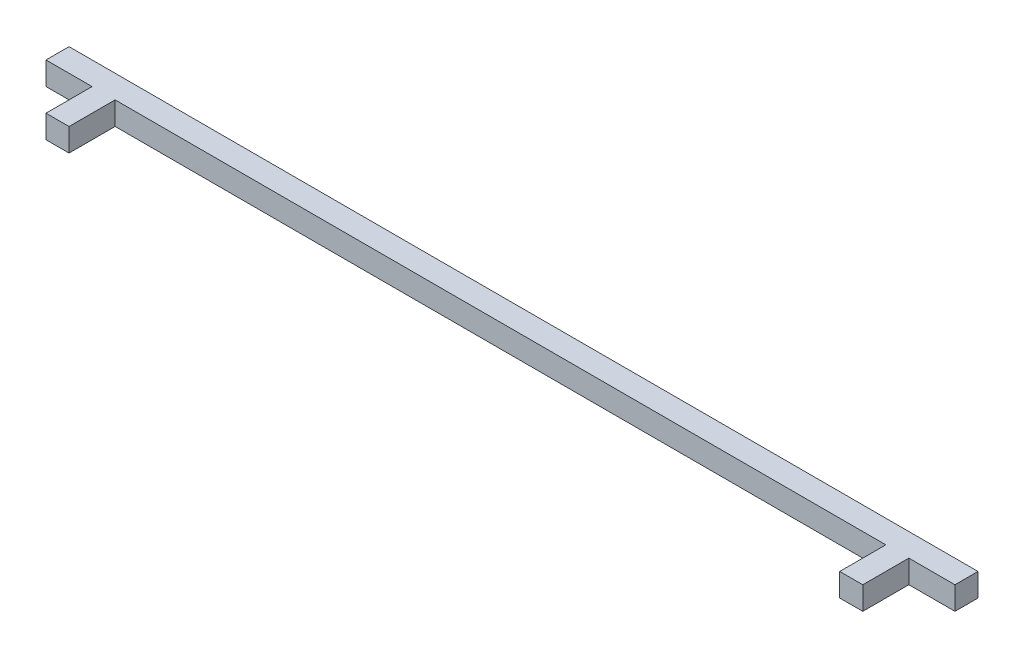
ISO-10303-21;
HEADER;
FILE_DESCRIPTION(('STEP AP214'),'2;1');
FILE_NAME('part.step','',(''),(''),'','','');
FILE_SCHEMA(('AUTOMOTIVE_DESIGN { 1 0 10303 214 1 1 1 1 }'));
ENDSEC;
DATA;
#1=APPLICATION_CONTEXT('core data for automotive mechanical design processes');
#2=APPLICATION_PROTOCOL_DEFINITION('international standard','automotive_design',2000,#1);
#3=PRODUCT_CONTEXT('',#1,'mechanical');
#4=PRODUCT('Part','Part','',(#3));
#5=PRODUCT_RELATED_PRODUCT_CATEGORY('part','',(#4));
#6=PRODUCT_DEFINITION_FORMATION('','',#4);
#7=PRODUCT_DEFINITION_CONTEXT('part definition',#1,'design');
#8=PRODUCT_DEFINITION('design','',#6,#7);
#9=PRODUCT_DEFINITION_SHAPE('','',#8);
#10=(LENGTH_UNIT() NAMED_UNIT(*) SI_UNIT(.MILLI.,.METRE.));
#11=(NAMED_UNIT(*) PLANE_ANGLE_UNIT() SI_UNIT($,.RADIAN.));
#12=(NAMED_UNIT(*) SI_UNIT($,.STERADIAN.) SOLID_ANGLE_UNIT());
#13=UNCERTAINTY_MEASURE_WITH_UNIT(LENGTH_MEASURE(1.E-05),#10,'distance_accuracy_value','');
#14=(GEOMETRIC_REPRESENTATION_CONTEXT(3) GLOBAL_UNCERTAINTY_ASSIGNED_CONTEXT((#13)) GLOBAL_UNIT_ASSIGNED_CONTEXT((#10,
#11,#12)) REPRESENTATION_CONTEXT('',''));
#15=CARTESIAN_POINT('',(0.,0.,0.));
#16=DIRECTION('',(0.,0.,1.));
#17=DIRECTION('',(1.,0.,0.));
#18=AXIS2_PLACEMENT_3D('',#15,#16,#17);
#19=CARTESIAN_POINT('',(6.,3.,0.));
#20=DIRECTION('',(0.,0.,-1.));
#21=DIRECTION('',(-1.,0.,0.));
#22=AXIS2_PLACEMENT_3D('',#19,#20,#21);
#23=PLANE('',#22);
#24=DIRECTION('',(1.,0.,0.));
#25=VECTOR('',#24,1.);
#26=CARTESIAN_POINT('',(6.,0.,0.));
#27=LINE('',#26,#25);
#28=CARTESIAN_POINT('',(0.,0.,0.));
#29=VERTEX_POINT('',#28);
#30=CARTESIAN_POINT('',(6.,0.,0.));
#31=VERTEX_POINT('',#30);
#32=EDGE_CURVE('E153',#29,#31,#27,.T.);
#33=ORIENTED_EDGE('',*,*,#32,.T.);
#34=DIRECTION('',(0.,-1.,0.));
#35=VECTOR('',#34,1.);
#36=CARTESIAN_POINT('',(6.,3.,0.));
#37=LINE('',#36,#35);
#38=CARTESIAN_POINT('',(6.,3.,0.));
#39=VERTEX_POINT('',#38);
#40=EDGE_CURVE('E11',#39,#31,#37,.T.);
#41=ORIENTED_EDGE('',*,*,#40,.F.);
#42=DIRECTION('',(1.,0.,0.));
#43=VECTOR('',#42,1.);
#44=CARTESIAN_POINT('',(6.,3.,0.));
#45=LINE('',#44,#43);
#46=CARTESIAN_POINT('',(0.,3.,0.));
#47=VERTEX_POINT('',#46);
#48=EDGE_CURVE('E175',#47,#39,#45,.T.);
#49=ORIENTED_EDGE('',*,*,#48,.F.);
#50=DIRECTION('',(0.,-1.,0.));
#51=VECTOR('',#50,1.);
#52=CARTESIAN_POINT('',(0.,3.,0.));
#53=LINE('',#52,#51);
#54=EDGE_CURVE('E149',#47,#29,#53,.T.);
#55=ORIENTED_EDGE('',*,*,#54,.T.);
#56=EDGE_LOOP('',(#33,#41,#49,#55));
#57=FACE_BOUND('',#56,.T.);
#58=ADVANCED_FACE('F33',(#57),#23,.F.);
#59=CARTESIAN_POINT('',(6.,3.,6.00000000000003));
#60=DIRECTION('',(1.,0.,0.));
#61=DIRECTION('',(0.,0.,-1.));
#62=AXIS2_PLACEMENT_3D('',#59,#60,#61);
#63=PLANE('',#62);
#64=DIRECTION('',(0.,0.,1.));
#65=VECTOR('',#64,1.);
#66=CARTESIAN_POINT('',(6.,0.,6.00000000000003));
#67=LINE('',#66,#65);
#68=CARTESIAN_POINT('',(6.,0.,6.00000000000003));
#69=VERTEX_POINT('',#68);
#70=EDGE_CURVE('E156',#31,#69,#67,.T.);
#71=ORIENTED_EDGE('',*,*,#70,.T.);
#72=DIRECTION('',(0.,-1.,0.));
#73=VECTOR('',#72,1.);
#74=CARTESIAN_POINT('',(6.,3.,6.00000000000003));
#75=LINE('',#74,#73);
#76=CARTESIAN_POINT('',(6.,3.,6.00000000000003));
#77=VERTEX_POINT('',#76);
#78=EDGE_CURVE('E41',#77,#69,#75,.T.);
#79=ORIENTED_EDGE('',*,*,#78,.F.);
#80=DIRECTION('',(0.,0.,1.));
#81=VECTOR('',#80,1.);
#82=CARTESIAN_POINT('',(6.,3.,6.00000000000003));
#83=LINE('',#82,#81);
#84=EDGE_CURVE('E104',#39,#77,#83,.T.);
#85=ORIENTED_EDGE('',*,*,#84,.F.);
#86=ORIENTED_EDGE('',*,*,#40,.T.);
#87=EDGE_LOOP('',(#71,#79,#85,#86));
#88=FACE_BOUND('',#87,.T.);
#89=ADVANCED_FACE('F253',(#88),#63,.F.);
#90=CARTESIAN_POINT('',(9.,3.,6.00000000000003));
#91=DIRECTION('',(0.,0.,-1.));
#92=DIRECTION('',(-1.,0.,0.));
#93=AXIS2_PLACEMENT_3D('',#90,#91,#92);
#94=PLANE('',#93);
#95=DIRECTION('',(1.,0.,0.));
#96=VECTOR('',#95,1.);
#97=CARTESIAN_POINT('',(9.,0.,6.00000000000003));
#98=LINE('',#97,#96);
#99=CARTESIAN_POINT('',(9.,0.,6.00000000000003));
#100=VERTEX_POINT('',#99);
#101=EDGE_CURVE('E158',#69,#100,#98,.T.);
#102=ORIENTED_EDGE('',*,*,#101,.T.);
#103=DIRECTION('',(0.,-1.,0.));
#104=VECTOR('',#103,1.);
#105=CARTESIAN_POINT('',(9.,3.,6.00000000000003));
#106=LINE('',#105,#104);
#107=CARTESIAN_POINT('',(9.,3.,6.00000000000003));
#108=VERTEX_POINT('',#107);
#109=EDGE_CURVE('E194',#108,#100,#106,.T.);
#110=ORIENTED_EDGE('',*,*,#109,.F.);
#111=DIRECTION('',(1.,0.,0.));
#112=VECTOR('',#111,1.);
#113=CARTESIAN_POINT('',(9.,3.,6.00000000000003));
#114=LINE('',#113,#112);
#115=EDGE_CURVE('E202',#77,#108,#114,.T.);
#116=ORIENTED_EDGE('',*,*,#115,.F.);
#117=ORIENTED_EDGE('',*,*,#78,.T.);
#118=EDGE_LOOP('',(#102,#110,#116,#117));
#119=FACE_BOUND('',#118,.T.);
#120=ADVANCED_FACE('F200',(#119),#94,.F.);
#121=CARTESIAN_POINT('',(9.,3.,0.));
#122=DIRECTION('',(-1.,0.,0.));
#123=DIRECTION('',(0.,0.,1.));
#124=AXIS2_PLACEMENT_3D('',#121,#122,#123);
#125=PLANE('',#124);
#126=DIRECTION('',(0.,0.,-1.));
#127=VECTOR('',#126,1.);
#128=CARTESIAN_POINT('',(9.,0.,0.));
#129=LINE('',#128,#127);
#130=CARTESIAN_POINT('',(9.,0.,0.));
#131=VERTEX_POINT('',#130);
#132=EDGE_CURVE('E160',#100,#131,#129,.T.);
#133=ORIENTED_EDGE('',*,*,#132,.T.);
#134=DIRECTION('',(0.,-1.,0.));
#135=VECTOR('',#134,1.);
#136=CARTESIAN_POINT('',(9.,3.,0.));
#137=LINE('',#136,#135);
#138=CARTESIAN_POINT('',(9.,3.,0.));
#139=VERTEX_POINT('',#138);
#140=EDGE_CURVE('E191',#139,#131,#137,.T.);
#141=ORIENTED_EDGE('',*,*,#140,.F.);
#142=DIRECTION('',(0.,0.,-1.));
#143=VECTOR('',#142,1.);
#144=CARTESIAN_POINT('',(9.,3.,0.));
#145=LINE('',#144,#143);
#146=EDGE_CURVE('E220',#108,#139,#145,.T.);
#147=ORIENTED_EDGE('',*,*,#146,.F.);
#148=ORIENTED_EDGE('',*,*,#109,.T.);
#149=EDGE_LOOP('',(#133,#141,#147,#148));
#150=FACE_BOUND('',#149,.T.);
#151=ADVANCED_FACE('F211',(#150),#125,.F.);
#152=CARTESIAN_POINT('',(109.32,3.,0.));
#153=DIRECTION('',(0.,0.,-1.));
#154=DIRECTION('',(-1.,0.,0.));
#155=AXIS2_PLACEMENT_3D('',#152,#153,#154);
#156=PLANE('',#155);
#157=DIRECTION('',(1.,0.,0.));
#158=VECTOR('',#157,1.);
#159=CARTESIAN_POINT('',(109.32,0.,0.));
#160=LINE('',#159,#158);
#161=CARTESIAN_POINT('',(109.32,0.,0.));
#162=VERTEX_POINT('',#161);
#163=EDGE_CURVE('E162',#131,#162,#160,.T.);
#164=ORIENTED_EDGE('',*,*,#163,.T.);
#165=DIRECTION('',(0.,-1.,0.));
#166=VECTOR('',#165,1.);
#167=CARTESIAN_POINT('',(109.32,3.,0.));
#168=LINE('',#167,#166);
#169=CARTESIAN_POINT('',(109.32,3.,0.));
#170=VERTEX_POINT('',#169);
#171=EDGE_CURVE('E188',#170,#162,#168,.T.);
#172=ORIENTED_EDGE('',*,*,#171,.F.);
#173=DIRECTION('',(1.,0.,0.));
#174=VECTOR('',#173,1.);
#175=CARTESIAN_POINT('',(109.32,3.,0.));
#176=LINE('',#175,#174);
#177=EDGE_CURVE('E217',#139,#170,#176,.T.);
#178=ORIENTED_EDGE('',*,*,#177,.F.);
#179=ORIENTED_EDGE('',*,*,#140,.T.);
#180=EDGE_LOOP('',(#164,#172,#178,#179));
#181=FACE_BOUND('',#180,.T.);
#182=ADVANCED_FACE('F215',(#181),#156,.F.);
#183=CARTESIAN_POINT('',(109.32,3.,6.));
#184=DIRECTION('',(1.,0.,0.));
#185=DIRECTION('',(0.,0.,-1.));
#186=AXIS2_PLACEMENT_3D('',#183,#184,#185);
#187=PLANE('',#186);
#188=DIRECTION('',(0.,0.,1.));
#189=VECTOR('',#188,1.);
#190=CARTESIAN_POINT('',(109.32,0.,6.));
#191=LINE('',#190,#189);
#192=CARTESIAN_POINT('',(109.32,0.,6.));
#193=VERTEX_POINT('',#192);
#194=EDGE_CURVE('E164',#162,#193,#191,.T.);
#195=ORIENTED_EDGE('',*,*,#194,.T.);
#196=DIRECTION('',(0.,-1.,0.));
#197=VECTOR('',#196,1.);
#198=CARTESIAN_POINT('',(109.32,3.,6.));
#199=LINE('',#198,#197);
#200=CARTESIAN_POINT('',(109.32,3.,6.));
#201=VERTEX_POINT('',#200);
#202=EDGE_CURVE('E185',#201,#193,#199,.T.);
#203=ORIENTED_EDGE('',*,*,#202,.F.);
#204=DIRECTION('',(0.,0.,1.));
#205=VECTOR('',#204,1.);
#206=CARTESIAN_POINT('',(109.32,3.,6.));
#207=LINE('',#206,#205);
#208=EDGE_CURVE('E219',#170,#201,#207,.T.);
#209=ORIENTED_EDGE('',*,*,#208,.F.);
#210=ORIENTED_EDGE('',*,*,#171,.T.);
#211=EDGE_LOOP('',(#195,#203,#209,#210));
#212=FACE_BOUND('',#211,.T.);
#213=ADVANCED_FACE('F266',(#212),#187,.F.);
#214=CARTESIAN_POINT('',(112.32,3.,6.));
#215=DIRECTION('',(0.,0.,-1.));
#216=DIRECTION('',(-1.,0.,0.));
#217=AXIS2_PLACEMENT_3D('',#214,#215,#216);
#218=PLANE('',#217);
#219=DIRECTION('',(1.,0.,0.));
#220=VECTOR('',#219,1.);
#221=CARTESIAN_POINT('',(112.32,0.,6.));
#222=LINE('',#221,#220);
#223=CARTESIAN_POINT('',(112.32,0.,6.));
#224=VERTEX_POINT('',#223);
#225=EDGE_CURVE('E166',#193,#224,#222,.T.);
#226=ORIENTED_EDGE('',*,*,#225,.T.);
#227=DIRECTION('',(0.,-1.,0.));
#228=VECTOR('',#227,1.);
#229=CARTESIAN_POINT('',(112.32,3.,6.));
#230=LINE('',#229,#228);
#231=CARTESIAN_POINT('',(112.32,3.,6.));
#232=VERTEX_POINT('',#231);
#233=EDGE_CURVE('E182',#232,#224,#230,.T.);
#234=ORIENTED_EDGE('',*,*,#233,.F.);
#235=DIRECTION('',(1.,0.,0.));
#236=VECTOR('',#235,1.);
#237=CARTESIAN_POINT('',(112.32,3.,6.));
#238=LINE('',#237,#236);
#239=EDGE_CURVE('E222',#201,#232,#238,.T.);
#240=ORIENTED_EDGE('',*,*,#239,.F.);
#241=ORIENTED_EDGE('',*,*,#202,.T.);
#242=EDGE_LOOP('',(#226,#234,#240,#241));
#243=FACE_BOUND('',#242,.T.);
#244=ADVANCED_FACE('F269',(#243),#218,.F.);
#245=CARTESIAN_POINT('',(112.32,3.,0.));
#246=DIRECTION('',(-1.,0.,0.));
#247=DIRECTION('',(0.,0.,1.));
#248=AXIS2_PLACEMENT_3D('',#245,#246,#247);
#249=PLANE('',#248);
#250=DIRECTION('',(0.,0.,-1.));
#251=VECTOR('',#250,1.);
#252=CARTESIAN_POINT('',(112.32,0.,0.));
#253=LINE('',#252,#251);
#254=CARTESIAN_POINT('',(112.32,0.,0.));
#255=VERTEX_POINT('',#254);
#256=EDGE_CURVE('E168',#224,#255,#253,.T.);
#257=ORIENTED_EDGE('',*,*,#256,.T.);
#258=DIRECTION('',(0.,-1.,0.));
#259=VECTOR('',#258,1.);
#260=CARTESIAN_POINT('',(112.32,3.,0.));
#261=LINE('',#260,#259);
#262=CARTESIAN_POINT('',(112.32,3.,0.));
#263=VERTEX_POINT('',#262);
#264=EDGE_CURVE('E179',#263,#255,#261,.T.);
#265=ORIENTED_EDGE('',*,*,#264,.F.);
#266=DIRECTION('',(0.,0.,-1.));
#267=VECTOR('',#266,1.);
#268=CARTESIAN_POINT('',(112.32,3.,0.));
#269=LINE('',#268,#267);
#270=EDGE_CURVE('E228',#232,#263,#269,.T.);
#271=ORIENTED_EDGE('',*,*,#270,.F.);
#272=ORIENTED_EDGE('',*,*,#233,.T.);
#273=EDGE_LOOP('',(#257,#265,#271,#272));
#274=FACE_BOUND('',#273,.T.);
#275=ADVANCED_FACE('F234',(#274),#249,.F.);
#276=CARTESIAN_POINT('',(118.32,3.,0.));
#277=DIRECTION('',(0.,0.,-1.));
#278=DIRECTION('',(-1.,0.,0.));
#279=AXIS2_PLACEMENT_3D('',#276,#277,#278);
#280=PLANE('',#279);
#281=DIRECTION('',(1.,0.,0.));
#282=VECTOR('',#281,1.);
#283=CARTESIAN_POINT('',(118.32,0.,0.));
#284=LINE('',#283,#282);
#285=CARTESIAN_POINT('',(118.32,0.,0.));
#286=VERTEX_POINT('',#285);
#287=EDGE_CURVE('E170',#255,#286,#284,.T.);
#288=ORIENTED_EDGE('',*,*,#287,.T.);
#289=DIRECTION('',(0.,-1.,0.));
#290=VECTOR('',#289,1.);
#291=CARTESIAN_POINT('',(118.32,3.,0.));
#292=LINE('',#291,#290);
#293=CARTESIAN_POINT('',(118.32,3.,0.));
#294=VERTEX_POINT('',#293);
#295=EDGE_CURVE('E144',#294,#286,#292,.T.);
#296=ORIENTED_EDGE('',*,*,#295,.F.);
#297=DIRECTION('',(1.,0.,0.));
#298=VECTOR('',#297,1.);
#299=CARTESIAN_POINT('',(118.32,3.,0.));
#300=LINE('',#299,#298);
#301=EDGE_CURVE('E135',#263,#294,#300,.T.);
#302=ORIENTED_EDGE('',*,*,#301,.F.);
#303=ORIENTED_EDGE('',*,*,#264,.T.);
#304=EDGE_LOOP('',(#288,#296,#302,#303));
#305=FACE_BOUND('',#304,.T.);
#306=ADVANCED_FACE('F238',(#305),#280,.F.);
#307=CARTESIAN_POINT('',(118.32,3.,-3.));
#308=DIRECTION('',(-1.,0.,0.));
#309=DIRECTION('',(0.,0.,1.));
#310=AXIS2_PLACEMENT_3D('',#307,#308,#309);
#311=PLANE('',#310);
#312=DIRECTION('',(0.,0.,-1.));
#313=VECTOR('',#312,1.);
#314=CARTESIAN_POINT('',(118.32,0.,-3.));
#315=LINE('',#314,#313);
#316=CARTESIAN_POINT('',(118.32,0.,-3.));
#317=VERTEX_POINT('',#316);
#318=EDGE_CURVE('E143',#286,#317,#315,.T.);
#319=ORIENTED_EDGE('',*,*,#318,.T.);
#320=DIRECTION('',(0.,-1.,0.));
#321=VECTOR('',#320,1.);
#322=CARTESIAN_POINT('',(118.32,3.,-3.));
#323=LINE('',#322,#321);
#324=CARTESIAN_POINT('',(118.32,3.,-3.));
#325=VERTEX_POINT('',#324);
#326=EDGE_CURVE('E140',#325,#317,#323,.T.);
#327=ORIENTED_EDGE('',*,*,#326,.F.);
#328=DIRECTION('',(0.,0.,-1.));
#329=VECTOR('',#328,1.);
#330=CARTESIAN_POINT('',(118.32,3.,-3.));
#331=LINE('',#330,#329);
#332=EDGE_CURVE('E129',#294,#325,#331,.T.);
#333=ORIENTED_EDGE('',*,*,#332,.F.);
#334=ORIENTED_EDGE('',*,*,#295,.T.);
#335=EDGE_LOOP('',(#319,#327,#333,#334));
#336=FACE_BOUND('',#335,.T.);
#337=ADVANCED_FACE('F141',(#336),#311,.F.);
#338=CARTESIAN_POINT('',(0.,3.,-3.));
#339=DIRECTION('',(0.,0.,1.));
#340=DIRECTION('',(1.,0.,0.));
#341=AXIS2_PLACEMENT_3D('',#338,#339,#340);
#342=PLANE('',#341);
#343=DIRECTION('',(-1.,0.,0.));
#344=VECTOR('',#343,1.);
#345=CARTESIAN_POINT('',(0.,0.,-3.));
#346=LINE('',#345,#344);
#347=CARTESIAN_POINT('',(0.,0.,-3.));
#348=VERTEX_POINT('',#347);
#349=EDGE_CURVE('E90',#317,#348,#346,.T.);
#350=ORIENTED_EDGE('',*,*,#349,.T.);
#351=DIRECTION('',(0.,-1.,0.));
#352=VECTOR('',#351,1.);
#353=CARTESIAN_POINT('',(0.,3.,-3.));
#354=LINE('',#353,#352);
#355=CARTESIAN_POINT('',(0.,3.,-3.));
#356=VERTEX_POINT('',#355);
#357=EDGE_CURVE('E145',#356,#348,#354,.T.);
#358=ORIENTED_EDGE('',*,*,#357,.F.);
#359=DIRECTION('',(-1.,0.,0.));
#360=VECTOR('',#359,1.);
#361=CARTESIAN_POINT('',(0.,3.,-3.));
#362=LINE('',#361,#360);
#363=EDGE_CURVE('E133',#325,#356,#362,.T.);
#364=ORIENTED_EDGE('',*,*,#363,.F.);
#365=ORIENTED_EDGE('',*,*,#326,.T.);
#366=EDGE_LOOP('',(#350,#358,#364,#365));
#367=FACE_BOUND('',#366,.T.);
#368=ADVANCED_FACE('F147',(#367),#342,.F.);
#369=CARTESIAN_POINT('',(0.,3.,0.));
#370=DIRECTION('',(1.,0.,0.));
#371=DIRECTION('',(0.,0.,-1.));
#372=AXIS2_PLACEMENT_3D('',#369,#370,#371);
#373=PLANE('',#372);
#374=DIRECTION('',(0.,0.,1.));
#375=VECTOR('',#374,1.);
#376=CARTESIAN_POINT('',(0.,0.,0.));
#377=LINE('',#376,#375);
#378=EDGE_CURVE('E96',#348,#29,#377,.T.);
#379=ORIENTED_EDGE('',*,*,#378,.T.);
#380=ORIENTED_EDGE('',*,*,#54,.F.);
#381=DIRECTION('',(0.,0.,1.));
#382=VECTOR('',#381,1.);
#383=CARTESIAN_POINT('',(0.,3.,0.));
#384=LINE('',#383,#382);
#385=EDGE_CURVE('E49',#356,#47,#384,.T.);
#386=ORIENTED_EDGE('',*,*,#385,.F.);
#387=ORIENTED_EDGE('',*,*,#357,.T.);
#388=EDGE_LOOP('',(#379,#380,#386,#387));
#389=FACE_BOUND('',#388,.T.);
#390=ADVANCED_FACE('F242',(#389),#373,.F.);
#391=CARTESIAN_POINT('',(0.,3.,0.));
#392=DIRECTION('',(0.,-1.,0.));
#393=DIRECTION('',(0.,0.,-1.));
#394=AXIS2_PLACEMENT_3D('',#391,#392,#393);
#395=PLANE('',#394);
#396=ORIENTED_EDGE('',*,*,#48,.T.);
#397=ORIENTED_EDGE('',*,*,#84,.T.);
#398=ORIENTED_EDGE('',*,*,#115,.T.);
#399=ORIENTED_EDGE('',*,*,#146,.T.);
#400=ORIENTED_EDGE('',*,*,#177,.T.);
#401=ORIENTED_EDGE('',*,*,#208,.T.);
#402=ORIENTED_EDGE('',*,*,#239,.T.);
#403=ORIENTED_EDGE('',*,*,#270,.T.);
#404=ORIENTED_EDGE('',*,*,#301,.T.);
#405=ORIENTED_EDGE('',*,*,#332,.T.);
#406=ORIENTED_EDGE('',*,*,#363,.T.);
#407=ORIENTED_EDGE('',*,*,#385,.T.);
#408=EDGE_LOOP('',(#396,#397,#398,#399,#400,#401,#402,#403,#404,#405,#406,#407));
#409=FACE_BOUND('',#408,.T.);
#410=ADVANCED_FACE('F131',(#409),#395,.F.);
#411=CARTESIAN_POINT('',(0.,0.,0.));
#412=DIRECTION('',(0.,-1.,0.));
#413=DIRECTION('',(0.,0.,-1.));
#414=AXIS2_PLACEMENT_3D('',#411,#412,#413);
#415=PLANE('',#414);
#416=ORIENTED_EDGE('',*,*,#32,.F.);
#417=ORIENTED_EDGE('',*,*,#378,.F.);
#418=ORIENTED_EDGE('',*,*,#349,.F.);
#419=ORIENTED_EDGE('',*,*,#318,.F.);
#420=ORIENTED_EDGE('',*,*,#287,.F.);
#421=ORIENTED_EDGE('',*,*,#256,.F.);
#422=ORIENTED_EDGE('',*,*,#225,.F.);
#423=ORIENTED_EDGE('',*,*,#194,.F.);
#424=ORIENTED_EDGE('',*,*,#163,.F.);
#425=ORIENTED_EDGE('',*,*,#132,.F.);
#426=ORIENTED_EDGE('',*,*,#101,.F.);
#427=ORIENTED_EDGE('',*,*,#70,.F.);
#428=EDGE_LOOP('',(#416,#417,#418,#419,#420,#421,#422,#423,#424,#425,#426,#427));
#429=FACE_BOUND('',#428,.T.);
#430=ADVANCED_FACE('F206',(#429),#415,.T.);
#431=CLOSED_SHELL('',(#58,#89,#120,#151,#182,#213,#244,#275,#306,#337,#368,#390,#410,#430));
#432=MANIFOLD_SOLID_BREP('B2',#431);
#433=ADVANCED_BREP_SHAPE_REPRESENTATION('',(#18,#432),#14);
#434=SHAPE_DEFINITION_REPRESENTATION(#9,#433);
ENDSEC;
END-ISO-10303-21;
